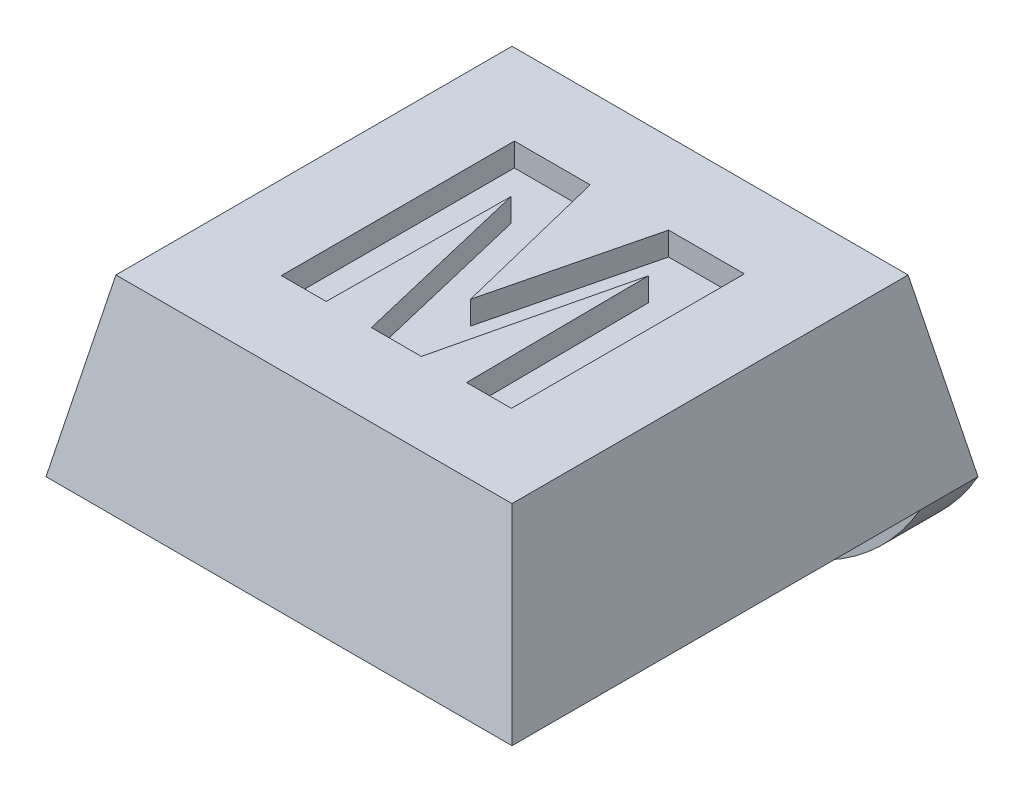
ISO-10303-21;
HEADER;
FILE_DESCRIPTION(('STEP AP214'),'2;1');
FILE_NAME('part.step','',(''),(''),'','','');
FILE_SCHEMA(('AUTOMOTIVE_DESIGN { 1 0 10303 214 1 1 1 1 }'));
ENDSEC;
DATA;
#1=APPLICATION_CONTEXT('core data for automotive mechanical design processes');
#2=APPLICATION_PROTOCOL_DEFINITION('international standard','automotive_design',2000,#1);
#3=PRODUCT_CONTEXT('',#1,'mechanical');
#4=PRODUCT('Part','Part','',(#3));
#5=PRODUCT_RELATED_PRODUCT_CATEGORY('part','',(#4));
#6=PRODUCT_DEFINITION_FORMATION('','',#4);
#7=PRODUCT_DEFINITION_CONTEXT('part definition',#1,'design');
#8=PRODUCT_DEFINITION('design','',#6,#7);
#9=PRODUCT_DEFINITION_SHAPE('','',#8);
#10=(LENGTH_UNIT() NAMED_UNIT(*) SI_UNIT(.MILLI.,.METRE.));
#11=(NAMED_UNIT(*) PLANE_ANGLE_UNIT() SI_UNIT($,.RADIAN.));
#12=(NAMED_UNIT(*) SI_UNIT($,.STERADIAN.) SOLID_ANGLE_UNIT());
#13=UNCERTAINTY_MEASURE_WITH_UNIT(LENGTH_MEASURE(1.E-05),#10,'distance_accuracy_value','');
#14=(GEOMETRIC_REPRESENTATION_CONTEXT(3) GLOBAL_UNCERTAINTY_ASSIGNED_CONTEXT((#13)) GLOBAL_UNIT_ASSIGNED_CONTEXT((#10,
#11,#12)) REPRESENTATION_CONTEXT('',''));
#15=CARTESIAN_POINT('',(0.,0.,0.));
#16=DIRECTION('',(0.,0.,1.));
#17=DIRECTION('',(1.,0.,0.));
#18=AXIS2_PLACEMENT_3D('',#15,#16,#17);
#19=CARTESIAN_POINT('',(0.,3.,0.));
#20=DIRECTION('',(0.,-1.,0.));
#21=DIRECTION('',(0.,0.,-1.));
#22=AXIS2_PLACEMENT_3D('',#19,#20,#21);
#23=PLANE('',#22);
#24=DIRECTION('',(-1.,0.,0.));
#25=VECTOR('',#24,1.);
#26=CARTESIAN_POINT('',(11.,3.,-0.6));
#27=LINE('',#26,#25);
#28=CARTESIAN_POINT('',(7.4,3.,-0.6));
#29=VERTEX_POINT('',#28);
#30=CARTESIAN_POINT('',(0.6,3.,-0.6));
#31=VERTEX_POINT('',#30);
#32=EDGE_CURVE('E235',#29,#31,#27,.T.);
#33=ORIENTED_EDGE('',*,*,#32,.F.);
#34=DIRECTION('',(0.,0.,1.));
#35=VECTOR('',#34,1.);
#36=CARTESIAN_POINT('',(7.4,3.,-8.));
#37=LINE('',#36,#35);
#38=CARTESIAN_POINT('',(7.4,3.,-7.4));
#39=VERTEX_POINT('',#38);
#40=EDGE_CURVE('E248',#39,#29,#37,.T.);
#41=ORIENTED_EDGE('',*,*,#40,.F.);
#42=DIRECTION('',(-1.,0.,0.));
#43=VECTOR('',#42,1.);
#44=CARTESIAN_POINT('',(11.,3.,-7.4));
#45=LINE('',#44,#43);
#46=CARTESIAN_POINT('',(0.599999999999999,3.,-7.4));
#47=VERTEX_POINT('',#46);
#48=EDGE_CURVE('E231',#39,#47,#45,.T.);
#49=ORIENTED_EDGE('',*,*,#48,.T.);
#50=DIRECTION('',(0.,0.,1.));
#51=VECTOR('',#50,1.);
#52=CARTESIAN_POINT('',(0.6,3.,-8.));
#53=LINE('',#52,#51);
#54=EDGE_CURVE('E251',#47,#31,#53,.T.);
#55=ORIENTED_EDGE('',*,*,#54,.T.);
#56=EDGE_LOOP('',(#33,#41,#49,#55));
#57=FACE_BOUND('',#56,.T.);
#58=DIRECTION('',(-1.,0.,0.));
#59=VECTOR('',#58,1.);
#60=CARTESIAN_POINT('',(2.79952143387891,3.,-2.0105672247147));
#61=LINE('',#60,#59);
#62=CARTESIAN_POINT('',(2.79952143387891,3.,-2.0105672247147));
#63=VERTEX_POINT('',#62);
#64=CARTESIAN_POINT('',(2.03029066464814,3.,-2.0105672247147));
#65=VERTEX_POINT('',#64);
#66=EDGE_CURVE('E58',#63,#65,#61,.T.);
#67=ORIENTED_EDGE('',*,*,#66,.T.);
#68=DIRECTION('',(0.,0.,-1.));
#69=VECTOR('',#68,1.);
#70=CARTESIAN_POINT('',(2.03029066464814,3.,-2.0105672247147));
#71=LINE('',#70,#69);
#72=CARTESIAN_POINT('',(2.03029066464814,3.,-6.0105672247147));
#73=VERTEX_POINT('',#72);
#74=EDGE_CURVE('E203',#65,#73,#71,.T.);
#75=ORIENTED_EDGE('',*,*,#74,.T.);
#76=DIRECTION('',(1.,0.,0.));
#77=VECTOR('',#76,1.);
#78=CARTESIAN_POINT('',(2.03029066464814,3.,-6.0105672247147));
#79=LINE('',#78,#77);
#80=CARTESIAN_POINT('',(3.33157271593019,3.,-6.0105672247147));
#81=VERTEX_POINT('',#80);
#82=EDGE_CURVE('E687',#73,#81,#79,.T.);
#83=ORIENTED_EDGE('',*,*,#82,.T.);
#84=DIRECTION('',(0.239515349551575,0.,0.970892577646563));
#85=VECTOR('',#84,1.);
#86=CARTESIAN_POINT('',(3.33157271593019,3.,-6.0105672247147));
#87=LINE('',#86,#85);
#88=CARTESIAN_POINT('',(4.00464963900711,3.,-3.28220184009932));
#89=VERTEX_POINT('',#88);
#90=EDGE_CURVE('E689',#81,#89,#87,.T.);
#91=ORIENTED_EDGE('',*,*,#90,.T.);
#92=DIRECTION('',(0.239515349551575,0.,-0.970892577646563));
#93=VECTOR('',#92,1.);
#94=CARTESIAN_POINT('',(4.00464963900711,3.,-3.28220184009932));
#95=LINE('',#94,#93);
#96=CARTESIAN_POINT('',(4.67772656208403,3.,-6.0105672247147));
#97=VERTEX_POINT('',#96);
#98=EDGE_CURVE('E694',#89,#97,#95,.T.);
#99=ORIENTED_EDGE('',*,*,#98,.T.);
#100=DIRECTION('',(1.,0.,0.));
#101=VECTOR('',#100,1.);
#102=CARTESIAN_POINT('',(4.67772656208403,3.,-6.0105672247147));
#103=LINE('',#102,#101);
#104=CARTESIAN_POINT('',(5.97900861336609,3.,-6.0105672247147));
#105=VERTEX_POINT('',#104);
#106=EDGE_CURVE('E704',#97,#105,#103,.T.);
#107=ORIENTED_EDGE('',*,*,#106,.T.);
#108=DIRECTION('',(0.,0.,1.));
#109=VECTOR('',#108,1.);
#110=CARTESIAN_POINT('',(5.97900861336609,3.,-6.0105672247147));
#111=LINE('',#110,#109);
#112=CARTESIAN_POINT('',(5.97900861336609,3.,-2.0105672247147));
#113=VERTEX_POINT('',#112);
#114=EDGE_CURVE('E708',#105,#113,#111,.T.);
#115=ORIENTED_EDGE('',*,*,#114,.T.);
#116=DIRECTION('',(-1.,0.,0.));
#117=VECTOR('',#116,1.);
#118=CARTESIAN_POINT('',(5.97900861336609,3.,-2.0105672247147));
#119=LINE('',#118,#117);
#120=CARTESIAN_POINT('',(5.20977784413532,3.,-2.0105672247147));
#121=VERTEX_POINT('',#120);
#122=EDGE_CURVE('E712',#113,#121,#119,.T.);
#123=ORIENTED_EDGE('',*,*,#122,.T.);
#124=DIRECTION('',(-0.00814222372760895,0.,-0.999966851546975));
#125=VECTOR('',#124,1.);
#126=CARTESIAN_POINT('',(5.20977784413532,3.,-2.0105672247147));
#127=LINE('',#126,#125);
#128=CARTESIAN_POINT('',(5.18413681849429,3.,-5.15960568625316));
#129=VERTEX_POINT('',#128);
#130=EDGE_CURVE('E716',#121,#129,#127,.T.);
#131=ORIENTED_EDGE('',*,*,#130,.T.);
#132=DIRECTION('',(-0.231921677320602,0.,0.972734463041584));
#133=VECTOR('',#132,1.);
#134=CARTESIAN_POINT('',(5.18413681849429,3.,-5.15960568625316));
#135=LINE('',#134,#133);
#136=CARTESIAN_POINT('',(4.43333553644301,3.,-2.0105672247147));
#137=VERTEX_POINT('',#136);
#138=EDGE_CURVE('E650',#129,#137,#135,.T.);
#139=ORIENTED_EDGE('',*,*,#138,.T.);
#140=DIRECTION('',(-1.,0.,0.));
#141=VECTOR('',#140,1.);
#142=CARTESIAN_POINT('',(4.43333553644301,3.,-2.0105672247147));
#143=LINE('',#142,#141);
#144=CARTESIAN_POINT('',(3.57596374157121,3.,-2.0105672247147));
#145=VERTEX_POINT('',#144);
#146=EDGE_CURVE('E645',#137,#145,#143,.T.);
#147=ORIENTED_EDGE('',*,*,#146,.T.);
#148=DIRECTION('',(-0.231921677320602,0.,-0.972734463041584));
#149=VECTOR('',#148,1.);
#150=CARTESIAN_POINT('',(3.57596374157121,3.,-2.0105672247147));
#151=LINE('',#150,#149);
#152=CARTESIAN_POINT('',(2.82516245951993,3.,-5.15960568625316));
#153=VERTEX_POINT('',#152);
#154=EDGE_CURVE('E639',#145,#153,#151,.T.);
#155=ORIENTED_EDGE('',*,*,#154,.T.);
#156=DIRECTION('',(-0.00814222372760895,0.,0.999966851546975));
#157=VECTOR('',#156,1.);
#158=CARTESIAN_POINT('',(2.82516245951993,3.,-5.15960568625316));
#159=LINE('',#158,#157);
#160=EDGE_CURVE('E199',#153,#63,#159,.T.);
#161=ORIENTED_EDGE('',*,*,#160,.T.);
#162=EDGE_LOOP('',(#67,#75,#83,#91,#99,#107,#115,#123,#131,#139,#147,#155,#161));
#163=FACE_BOUND('',#162,.T.);
#164=ADVANCED_FACE('F42',(#57,#163),#23,.F.);
#165=CARTESIAN_POINT('',(8.,0.,-8.));
#166=DIRECTION('',(-0.98058067569092,-0.196116135138184,0.));
#167=DIRECTION('',(0.196116135138184,-0.98058067569092,0.));
#168=AXIS2_PLACEMENT_3D('',#165,#166,#167);
#169=PLANE('',#168);
#170=DIRECTION('',(-0.192450089729875,0.962250448649376,-0.192450089729875));
#171=VECTOR('',#170,1.);
#172=CARTESIAN_POINT('',(7.7037037037037,1.48148148148148,-0.296296296296296));
#173=LINE('',#172,#171);
#174=CARTESIAN_POINT('',(8.,0.,0.));
#175=VERTEX_POINT('',#174);
#176=EDGE_CURVE('E245',#175,#29,#173,.T.);
#177=ORIENTED_EDGE('',*,*,#176,.F.);
#178=DIRECTION('',(0.,0.,-1.));
#179=VECTOR('',#178,1.);
#180=CARTESIAN_POINT('',(8.,0.,0.));
#181=LINE('',#180,#179);
#182=CARTESIAN_POINT('',(8.,0.,-7.));
#183=VERTEX_POINT('',#182);
#184=EDGE_CURVE('E264',#175,#183,#181,.T.);
#185=ORIENTED_EDGE('',*,*,#184,.T.);
#186=DIRECTION('',(0.,0.,1.));
#187=VECTOR('',#186,1.);
#188=CARTESIAN_POINT('',(8.,0.,-8.));
#189=LINE('',#188,#187);
#190=CARTESIAN_POINT('',(8.,0.,-8.));
#191=VERTEX_POINT('',#190);
#192=EDGE_CURVE('E205',#191,#183,#189,.T.);
#193=ORIENTED_EDGE('',*,*,#192,.F.);
#194=DIRECTION('',(0.192450089729875,-0.962250448649376,-0.192450089729875));
#195=VECTOR('',#194,1.);
#196=CARTESIAN_POINT('',(8.,0.,-8.));
#197=LINE('',#196,#195);
#198=EDGE_CURVE('E238',#39,#191,#197,.T.);
#199=ORIENTED_EDGE('',*,*,#198,.F.);
#200=ORIENTED_EDGE('',*,*,#40,.T.);
#201=EDGE_LOOP('',(#177,#185,#193,#199,#200));
#202=FACE_BOUND('',#201,.T.);
#203=ADVANCED_FACE('F332',(#202),#169,.F.);
#204=CARTESIAN_POINT('',(0.,0.,-8.));
#205=DIRECTION('',(0.98058067569092,-0.196116135138184,0.));
#206=DIRECTION('',(0.196116135138184,0.98058067569092,0.));
#207=AXIS2_PLACEMENT_3D('',#204,#205,#206);
#208=PLANE('',#207);
#209=DIRECTION('',(-0.192450089729875,-0.962250448649376,0.192450089729875));
#210=VECTOR('',#209,1.);
#211=CARTESIAN_POINT('',(0.296296296296296,1.48148148148148,-0.296296296296296));
#212=LINE('',#211,#210);
#213=CARTESIAN_POINT('',(0.,0.,0.));
#214=VERTEX_POINT('',#213);
#215=EDGE_CURVE('E292',#31,#214,#212,.T.);
#216=ORIENTED_EDGE('',*,*,#215,.F.);
#217=ORIENTED_EDGE('',*,*,#54,.F.);
#218=DIRECTION('',(0.192450089729875,0.962250448649376,0.192450089729875));
#219=VECTOR('',#218,1.);
#220=CARTESIAN_POINT('',(0.,0.,-8.));
#221=LINE('',#220,#219);
#222=CARTESIAN_POINT('',(0.,0.,-8.));
#223=VERTEX_POINT('',#222);
#224=EDGE_CURVE('E263',#223,#47,#221,.T.);
#225=ORIENTED_EDGE('',*,*,#224,.F.);
#226=DIRECTION('',(0.,0.,1.));
#227=VECTOR('',#226,1.);
#228=CARTESIAN_POINT('',(0.,0.,0.));
#229=LINE('',#228,#227);
#230=CARTESIAN_POINT('',(0.,0.,-7.));
#231=VERTEX_POINT('',#230);
#232=EDGE_CURVE('E268',#223,#231,#229,.T.);
#233=ORIENTED_EDGE('',*,*,#232,.T.);
#234=EDGE_CURVE('E255',#231,#214,#229,.T.);
#235=ORIENTED_EDGE('',*,*,#234,.T.);
#236=EDGE_LOOP('',(#216,#217,#225,#233,#235));
#237=FACE_BOUND('',#236,.T.);
#238=ADVANCED_FACE('F316',(#237),#208,.F.);
#239=CARTESIAN_POINT('',(0.,0.,0.));
#240=DIRECTION('',(0.,-1.,0.));
#241=DIRECTION('',(0.,0.,-1.));
#242=AXIS2_PLACEMENT_3D('',#239,#240,#241);
#243=PLANE('',#242);
#244=DIRECTION('',(-1.,0.,0.));
#245=VECTOR('',#244,1.);
#246=CARTESIAN_POINT('',(0.,0.,-7.));
#247=LINE('',#246,#245);
#248=EDGE_CURVE('E211',#183,#231,#247,.T.);
#249=ORIENTED_EDGE('',*,*,#248,.F.);
#250=ORIENTED_EDGE('',*,*,#184,.F.);
#251=DIRECTION('',(1.,0.,0.));
#252=VECTOR('',#251,1.);
#253=CARTESIAN_POINT('',(0.,0.,0.));
#254=LINE('',#253,#252);
#255=EDGE_CURVE('E265',#214,#175,#254,.T.);
#256=ORIENTED_EDGE('',*,*,#255,.F.);
#257=ORIENTED_EDGE('',*,*,#234,.F.);
#258=EDGE_LOOP('',(#249,#250,#256,#257));
#259=FACE_BOUND('',#258,.T.);
#260=CARTESIAN_POINT('',(4.,0.,-3.75));
#261=DIRECTION('',(0.,-1.,0.));
#262=DIRECTION('',(0.,0.,-1.));
#263=AXIS2_PLACEMENT_3D('',#260,#261,#262);
#264=CIRCLE('',#263,1.8);
#265=CARTESIAN_POINT('',(4.,0.,-5.55));
#266=VERTEX_POINT('',#265);
#267=EDGE_CURVE('E223',#266,#266,#264,.T.);
#268=ORIENTED_EDGE('',*,*,#267,.F.);
#269=EDGE_LOOP('',(#268));
#270=FACE_BOUND('',#269,.T.);
#271=ADVANCED_FACE('F327',(#259,#270),#243,.T.);
#272=CARTESIAN_POINT('',(11.,3.,-7.4));
#273=DIRECTION('',(0.,0.196116135138184,-0.98058067569092));
#274=DIRECTION('',(0.,0.98058067569092,0.196116135138184));
#275=AXIS2_PLACEMENT_3D('',#272,#273,#274);
#276=PLANE('',#275);
#277=ORIENTED_EDGE('',*,*,#198,.T.);
#278=DIRECTION('',(-1.,0.,0.));
#279=VECTOR('',#278,1.);
#280=CARTESIAN_POINT('',(0.,0.,-8.));
#281=LINE('',#280,#279);
#282=EDGE_CURVE('E259',#191,#223,#281,.T.);
#283=ORIENTED_EDGE('',*,*,#282,.T.);
#284=ORIENTED_EDGE('',*,*,#224,.T.);
#285=ORIENTED_EDGE('',*,*,#48,.F.);
#286=EDGE_LOOP('',(#277,#283,#284,#285));
#287=FACE_BOUND('',#286,.T.);
#288=ADVANCED_FACE('F311',(#287),#276,.T.);
#289=CARTESIAN_POINT('',(11.,0.,0.));
#290=DIRECTION('',(0.,0.196116135138184,0.98058067569092));
#291=DIRECTION('',(0.,-0.98058067569092,0.196116135138184));
#292=AXIS2_PLACEMENT_3D('',#289,#290,#291);
#293=PLANE('',#292);
#294=ORIENTED_EDGE('',*,*,#176,.T.);
#295=ORIENTED_EDGE('',*,*,#32,.T.);
#296=ORIENTED_EDGE('',*,*,#215,.T.);
#297=ORIENTED_EDGE('',*,*,#255,.T.);
#298=EDGE_LOOP('',(#294,#295,#296,#297));
#299=FACE_BOUND('',#298,.T.);
#300=ADVANCED_FACE('F358',(#299),#293,.T.);
#301=CARTESIAN_POINT('',(4.,0.8,-3.75));
#302=DIRECTION('',(0.,-1.,0.));
#303=DIRECTION('',(0.,0.,-1.));
#304=AXIS2_PLACEMENT_3D('',#301,#302,#303);
#305=CYLINDRICAL_SURFACE('',#304,1.8);
#306=CARTESIAN_POINT('',(4.,0.8,-3.75));
#307=DIRECTION('',(0.,-1.,0.));
#308=DIRECTION('',(0.,0.,-1.));
#309=AXIS2_PLACEMENT_3D('',#306,#307,#308);
#310=CIRCLE('',#309,1.8);
#311=CARTESIAN_POINT('',(4.,0.8,-5.55));
#312=VERTEX_POINT('',#311);
#313=EDGE_CURVE('E227',#312,#312,#310,.T.);
#314=ORIENTED_EDGE('',*,*,#313,.F.);
#315=EDGE_LOOP('',(#314));
#316=FACE_BOUND('',#315,.T.);
#317=ORIENTED_EDGE('',*,*,#267,.T.);
#318=EDGE_LOOP('',(#317));
#319=FACE_BOUND('',#318,.T.);
#320=ADVANCED_FACE('F365',(#316,#319),#305,.F.);
#321=CARTESIAN_POINT('',(4.,0.8,-3.75));
#322=DIRECTION('',(0.,-1.,0.));
#323=DIRECTION('',(0.,0.,-1.));
#324=AXIS2_PLACEMENT_3D('',#321,#322,#323);
#325=PLANE('',#324);
#326=ORIENTED_EDGE('',*,*,#313,.T.);
#327=EDGE_LOOP('',(#326));
#328=FACE_BOUND('',#327,.T.);
#329=ADVANCED_FACE('F369',(#328),#325,.T.);
#330=CARTESIAN_POINT('',(0.,-2.,-8.));
#331=DIRECTION('',(0.,0.,1.));
#332=DIRECTION('',(1.,0.,0.));
#333=AXIS2_PLACEMENT_3D('',#330,#331,#332);
#334=PLANE('',#333);
#335=ORIENTED_EDGE('',*,*,#282,.F.);
#336=CARTESIAN_POINT('',(4.53589838486225,2.,-8.));
#337=DIRECTION('',(0.,0.,1.));
#338=DIRECTION('',(1.,0.,0.));
#339=AXIS2_PLACEMENT_3D('',#336,#337,#338);
#340=CIRCLE('',#339,4.);
#341=CARTESIAN_POINT('',(4.53589838486225,-2.,-8.));
#342=VERTEX_POINT('',#341);
#343=EDGE_CURVE('E11',#191,#342,#340,.F.);
#344=ORIENTED_EDGE('',*,*,#343,.T.);
#345=DIRECTION('',(1.,0.,0.));
#346=VECTOR('',#345,1.);
#347=CARTESIAN_POINT('',(0.,-2.,-8.));
#348=LINE('',#347,#346);
#349=CARTESIAN_POINT('',(3.46410161513775,-2.,-8.));
#350=VERTEX_POINT('',#349);
#351=EDGE_CURVE('E217',#350,#342,#348,.T.);
#352=ORIENTED_EDGE('',*,*,#351,.F.);
#353=CARTESIAN_POINT('',(3.46410161513775,2.,-8.));
#354=DIRECTION('',(0.,0.,1.));
#355=DIRECTION('',(1.,0.,0.));
#356=AXIS2_PLACEMENT_3D('',#353,#354,#355);
#357=CIRCLE('',#356,4.);
#358=EDGE_CURVE('E51',#350,#223,#357,.F.);
#359=ORIENTED_EDGE('',*,*,#358,.T.);
#360=EDGE_LOOP('',(#335,#344,#352,#359));
#361=FACE_BOUND('',#360,.T.);
#362=ADVANCED_FACE('F304',(#361),#334,.F.);
#363=CARTESIAN_POINT('',(0.,-2.,-7.));
#364=DIRECTION('',(0.,0.,-1.));
#365=DIRECTION('',(-1.,0.,0.));
#366=AXIS2_PLACEMENT_3D('',#363,#364,#365);
#367=PLANE('',#366);
#368=DIRECTION('',(-1.,0.,0.));
#369=VECTOR('',#368,1.);
#370=CARTESIAN_POINT('',(0.,-2.,-7.));
#371=LINE('',#370,#369);
#372=CARTESIAN_POINT('',(4.53589838486225,-2.,-7.));
#373=VERTEX_POINT('',#372);
#374=CARTESIAN_POINT('',(3.46410161513775,-2.,-7.));
#375=VERTEX_POINT('',#374);
#376=EDGE_CURVE('E221',#373,#375,#371,.T.);
#377=ORIENTED_EDGE('',*,*,#376,.F.);
#378=CARTESIAN_POINT('',(4.53589838486225,2.,-7.));
#379=DIRECTION('',(0.,0.,-1.));
#380=DIRECTION('',(-1.,0.,0.));
#381=AXIS2_PLACEMENT_3D('',#378,#379,#380);
#382=CIRCLE('',#381,4.);
#383=EDGE_CURVE('E298',#373,#183,#382,.F.);
#384=ORIENTED_EDGE('',*,*,#383,.T.);
#385=ORIENTED_EDGE('',*,*,#248,.T.);
#386=CARTESIAN_POINT('',(3.46410161513775,2.,-7.));
#387=DIRECTION('',(0.,0.,-1.));
#388=DIRECTION('',(-1.,0.,0.));
#389=AXIS2_PLACEMENT_3D('',#386,#387,#388);
#390=CIRCLE('',#389,4.);
#391=EDGE_CURVE('E66',#231,#375,#390,.F.);
#392=ORIENTED_EDGE('',*,*,#391,.T.);
#393=EDGE_LOOP('',(#377,#384,#385,#392));
#394=FACE_BOUND('',#393,.T.);
#395=ADVANCED_FACE('F322',(#394),#367,.F.);
#396=CARTESIAN_POINT('',(0.,-2.,0.));
#397=DIRECTION('',(0.,1.,0.));
#398=DIRECTION('',(0.,0.,1.));
#399=AXIS2_PLACEMENT_3D('',#396,#397,#398);
#400=PLANE('',#399);
#401=ORIENTED_EDGE('',*,*,#351,.T.);
#402=DIRECTION('',(0.,0.,1.));
#403=VECTOR('',#402,1.);
#404=CARTESIAN_POINT('',(4.53589838486225,-2.,0.));
#405=LINE('',#404,#403);
#406=EDGE_CURVE('E291',#342,#373,#405,.T.);
#407=ORIENTED_EDGE('',*,*,#406,.T.);
#408=ORIENTED_EDGE('',*,*,#376,.T.);
#409=DIRECTION('',(0.,0.,-1.));
#410=VECTOR('',#409,1.);
#411=CARTESIAN_POINT('',(3.46410161513775,-2.,0.));
#412=LINE('',#411,#410);
#413=EDGE_CURVE('E287',#375,#350,#412,.T.);
#414=ORIENTED_EDGE('',*,*,#413,.T.);
#415=EDGE_LOOP('',(#401,#407,#408,#414));
#416=FACE_BOUND('',#415,.T.);
#417=ADVANCED_FACE('F320',(#416),#400,.F.);
#418=CARTESIAN_POINT('',(4.53589838486225,2.,-8.));
#419=DIRECTION('',(0.,0.,1.));
#420=DIRECTION('',(1.,0.,0.));
#421=AXIS2_PLACEMENT_3D('',#418,#419,#420);
#422=CYLINDRICAL_SURFACE('',#421,4.);
#423=ORIENTED_EDGE('',*,*,#343,.F.);
#424=ORIENTED_EDGE('',*,*,#192,.T.);
#425=ORIENTED_EDGE('',*,*,#383,.F.);
#426=ORIENTED_EDGE('',*,*,#406,.F.);
#427=EDGE_LOOP('',(#423,#424,#425,#426));
#428=FACE_BOUND('',#427,.T.);
#429=ADVANCED_FACE('F333',(#428),#422,.T.);
#430=CARTESIAN_POINT('',(3.46410161513775,2.,-8.));
#431=DIRECTION('',(0.,0.,-1.));
#432=DIRECTION('',(-1.,0.,0.));
#433=AXIS2_PLACEMENT_3D('',#430,#431,#432);
#434=CYLINDRICAL_SURFACE('',#433,4.);
#435=ORIENTED_EDGE('',*,*,#391,.F.);
#436=ORIENTED_EDGE('',*,*,#232,.F.);
#437=ORIENTED_EDGE('',*,*,#358,.F.);
#438=ORIENTED_EDGE('',*,*,#413,.F.);
#439=EDGE_LOOP('',(#435,#436,#437,#438));
#440=FACE_BOUND('',#439,.T.);
#441=ADVANCED_FACE('F44',(#440),#434,.T.);
#442=CARTESIAN_POINT('',(2.79952143387891,2.6,-2.0105672247147));
#443=DIRECTION('',(0.,0.,-1.));
#444=DIRECTION('',(-1.,0.,0.));
#445=AXIS2_PLACEMENT_3D('',#442,#443,#444);
#446=PLANE('',#445);
#447=ORIENTED_EDGE('',*,*,#66,.F.);
#448=DIRECTION('',(0.,1.,0.));
#449=VECTOR('',#448,1.);
#450=CARTESIAN_POINT('',(2.79952143387891,2.6,-2.0105672247147));
#451=LINE('',#450,#449);
#452=CARTESIAN_POINT('',(2.79952143387891,2.6,-2.0105672247147));
#453=VERTEX_POINT('',#452);
#454=EDGE_CURVE('E197',#453,#63,#451,.T.);
#455=ORIENTED_EDGE('',*,*,#454,.F.);
#456=DIRECTION('',(-1.,0.,0.));
#457=VECTOR('',#456,1.);
#458=CARTESIAN_POINT('',(2.79952143387891,2.6,-2.0105672247147));
#459=LINE('',#458,#457);
#460=CARTESIAN_POINT('',(2.03029066464814,2.6,-2.0105672247147));
#461=VERTEX_POINT('',#460);
#462=EDGE_CURVE('E187',#453,#461,#459,.T.);
#463=ORIENTED_EDGE('',*,*,#462,.T.);
#464=DIRECTION('',(0.,1.,0.));
#465=VECTOR('',#464,1.);
#466=CARTESIAN_POINT('',(2.03029066464814,2.6,-2.0105672247147));
#467=LINE('',#466,#465);
#468=EDGE_CURVE('E196',#461,#65,#467,.T.);
#469=ORIENTED_EDGE('',*,*,#468,.T.);
#470=EDGE_LOOP('',(#447,#455,#463,#469));
#471=FACE_BOUND('',#470,.T.);
#472=ADVANCED_FACE('F195',(#471),#446,.T.);
#473=CARTESIAN_POINT('',(2.03029066464814,2.6,-2.0105672247147));
#474=DIRECTION('',(1.,0.,0.));
#475=DIRECTION('',(0.,0.,-1.));
#476=AXIS2_PLACEMENT_3D('',#473,#474,#475);
#477=PLANE('',#476);
#478=ORIENTED_EDGE('',*,*,#74,.F.);
#479=ORIENTED_EDGE('',*,*,#468,.F.);
#480=DIRECTION('',(0.,0.,-1.));
#481=VECTOR('',#480,1.);
#482=CARTESIAN_POINT('',(2.03029066464814,2.6,-2.0105672247147));
#483=LINE('',#482,#481);
#484=CARTESIAN_POINT('',(2.03029066464814,2.6,-6.0105672247147));
#485=VERTEX_POINT('',#484);
#486=EDGE_CURVE('E183',#461,#485,#483,.T.);
#487=ORIENTED_EDGE('',*,*,#486,.T.);
#488=DIRECTION('',(0.,1.,0.));
#489=VECTOR('',#488,1.);
#490=CARTESIAN_POINT('',(2.03029066464814,2.6,-6.0105672247147));
#491=LINE('',#490,#489);
#492=EDGE_CURVE('E206',#485,#73,#491,.T.);
#493=ORIENTED_EDGE('',*,*,#492,.T.);
#494=EDGE_LOOP('',(#478,#479,#487,#493));
#495=FACE_BOUND('',#494,.T.);
#496=ADVANCED_FACE('F201',(#495),#477,.T.);
#497=CARTESIAN_POINT('',(2.03029066464814,2.6,-6.0105672247147));
#498=DIRECTION('',(0.,0.,1.));
#499=DIRECTION('',(1.,0.,0.));
#500=AXIS2_PLACEMENT_3D('',#497,#498,#499);
#501=PLANE('',#500);
#502=ORIENTED_EDGE('',*,*,#82,.F.);
#503=ORIENTED_EDGE('',*,*,#492,.F.);
#504=DIRECTION('',(1.,0.,0.));
#505=VECTOR('',#504,1.);
#506=CARTESIAN_POINT('',(2.03029066464814,2.6,-6.0105672247147));
#507=LINE('',#506,#505);
#508=CARTESIAN_POINT('',(3.33157271593019,2.6,-6.0105672247147));
#509=VERTEX_POINT('',#508);
#510=EDGE_CURVE('E189',#485,#509,#507,.T.);
#511=ORIENTED_EDGE('',*,*,#510,.T.);
#512=DIRECTION('',(0.,1.,0.));
#513=VECTOR('',#512,1.);
#514=CARTESIAN_POINT('',(3.33157271593019,2.6,-6.0105672247147));
#515=LINE('',#514,#513);
#516=EDGE_CURVE('E213',#509,#81,#515,.T.);
#517=ORIENTED_EDGE('',*,*,#516,.T.);
#518=EDGE_LOOP('',(#502,#503,#511,#517));
#519=FACE_BOUND('',#518,.T.);
#520=ADVANCED_FACE('F382',(#519),#501,.T.);
#521=CARTESIAN_POINT('',(3.33157271593019,2.6,-6.0105672247147));
#522=DIRECTION('',(-0.970892577646563,0.,0.239515349551575));
#523=DIRECTION('',(0.239515349551575,0.,0.970892577646563));
#524=AXIS2_PLACEMENT_3D('',#521,#522,#523);
#525=PLANE('',#524);
#526=ORIENTED_EDGE('',*,*,#90,.F.);
#527=ORIENTED_EDGE('',*,*,#516,.F.);
#528=DIRECTION('',(0.239515349551575,0.,0.970892577646563));
#529=VECTOR('',#528,1.);
#530=CARTESIAN_POINT('',(3.33157271593019,2.6,-6.0105672247147));
#531=LINE('',#530,#529);
#532=CARTESIAN_POINT('',(4.00464963900711,2.6,-3.28220184009932));
#533=VERTEX_POINT('',#532);
#534=EDGE_CURVE('E755',#509,#533,#531,.T.);
#535=ORIENTED_EDGE('',*,*,#534,.T.);
#536=DIRECTION('',(0.,1.,0.));
#537=VECTOR('',#536,1.);
#538=CARTESIAN_POINT('',(4.00464963900711,2.6,-3.28220184009932));
#539=LINE('',#538,#537);
#540=EDGE_CURVE('E680',#533,#89,#539,.T.);
#541=ORIENTED_EDGE('',*,*,#540,.T.);
#542=EDGE_LOOP('',(#526,#527,#535,#541));
#543=FACE_BOUND('',#542,.T.);
#544=ADVANCED_FACE('F385',(#543),#525,.T.);
#545=CARTESIAN_POINT('',(4.00464963900711,2.6,-3.28220184009932));
#546=DIRECTION('',(0.970892577646563,0.,0.239515349551575));
#547=DIRECTION('',(0.239515349551575,0.,-0.970892577646563));
#548=AXIS2_PLACEMENT_3D('',#545,#546,#547);
#549=PLANE('',#548);
#550=ORIENTED_EDGE('',*,*,#98,.F.);
#551=ORIENTED_EDGE('',*,*,#540,.F.);
#552=DIRECTION('',(0.239515349551575,0.,-0.970892577646563));
#553=VECTOR('',#552,1.);
#554=CARTESIAN_POINT('',(4.00464963900711,2.6,-3.28220184009932));
#555=LINE('',#554,#553);
#556=CARTESIAN_POINT('',(4.67772656208403,2.6,-6.0105672247147));
#557=VERTEX_POINT('',#556);
#558=EDGE_CURVE('E752',#533,#557,#555,.T.);
#559=ORIENTED_EDGE('',*,*,#558,.T.);
#560=DIRECTION('',(0.,1.,0.));
#561=VECTOR('',#560,1.);
#562=CARTESIAN_POINT('',(4.67772656208403,2.6,-6.0105672247147));
#563=LINE('',#562,#561);
#564=EDGE_CURVE('E677',#557,#97,#563,.T.);
#565=ORIENTED_EDGE('',*,*,#564,.T.);
#566=EDGE_LOOP('',(#550,#551,#559,#565));
#567=FACE_BOUND('',#566,.T.);
#568=ADVANCED_FACE('F389',(#567),#549,.T.);
#569=CARTESIAN_POINT('',(4.67772656208403,2.6,-6.0105672247147));
#570=DIRECTION('',(0.,0.,1.));
#571=DIRECTION('',(1.,0.,0.));
#572=AXIS2_PLACEMENT_3D('',#569,#570,#571);
#573=PLANE('',#572);
#574=ORIENTED_EDGE('',*,*,#106,.F.);
#575=ORIENTED_EDGE('',*,*,#564,.F.);
#576=DIRECTION('',(1.,0.,0.));
#577=VECTOR('',#576,1.);
#578=CARTESIAN_POINT('',(4.67772656208403,2.6,-6.0105672247147));
#579=LINE('',#578,#577);
#580=CARTESIAN_POINT('',(5.97900861336609,2.6,-6.0105672247147));
#581=VERTEX_POINT('',#580);
#582=EDGE_CURVE('E749',#557,#581,#579,.T.);
#583=ORIENTED_EDGE('',*,*,#582,.T.);
#584=DIRECTION('',(0.,1.,0.));
#585=VECTOR('',#584,1.);
#586=CARTESIAN_POINT('',(5.97900861336609,2.6,-6.0105672247147));
#587=LINE('',#586,#585);
#588=EDGE_CURVE('E674',#581,#105,#587,.T.);
#589=ORIENTED_EDGE('',*,*,#588,.T.);
#590=EDGE_LOOP('',(#574,#575,#583,#589));
#591=FACE_BOUND('',#590,.T.);
#592=ADVANCED_FACE('F393',(#591),#573,.T.);
#593=CARTESIAN_POINT('',(5.97900861336609,2.6,-6.0105672247147));
#594=DIRECTION('',(-1.,0.,0.));
#595=DIRECTION('',(0.,0.,1.));
#596=AXIS2_PLACEMENT_3D('',#593,#594,#595);
#597=PLANE('',#596);
#598=ORIENTED_EDGE('',*,*,#114,.F.);
#599=ORIENTED_EDGE('',*,*,#588,.F.);
#600=DIRECTION('',(0.,0.,1.));
#601=VECTOR('',#600,1.);
#602=CARTESIAN_POINT('',(5.97900861336609,2.6,-6.0105672247147));
#603=LINE('',#602,#601);
#604=CARTESIAN_POINT('',(5.97900861336609,2.6,-2.0105672247147));
#605=VERTEX_POINT('',#604);
#606=EDGE_CURVE('E746',#581,#605,#603,.T.);
#607=ORIENTED_EDGE('',*,*,#606,.T.);
#608=DIRECTION('',(0.,1.,0.));
#609=VECTOR('',#608,1.);
#610=CARTESIAN_POINT('',(5.97900861336609,2.6,-2.0105672247147));
#611=LINE('',#610,#609);
#612=EDGE_CURVE('E671',#605,#113,#611,.T.);
#613=ORIENTED_EDGE('',*,*,#612,.T.);
#614=EDGE_LOOP('',(#598,#599,#607,#613));
#615=FACE_BOUND('',#614,.T.);
#616=ADVANCED_FACE('F397',(#615),#597,.T.);
#617=CARTESIAN_POINT('',(5.97900861336609,2.6,-2.0105672247147));
#618=DIRECTION('',(0.,0.,-1.));
#619=DIRECTION('',(-1.,0.,0.));
#620=AXIS2_PLACEMENT_3D('',#617,#618,#619);
#621=PLANE('',#620);
#622=ORIENTED_EDGE('',*,*,#122,.F.);
#623=ORIENTED_EDGE('',*,*,#612,.F.);
#624=DIRECTION('',(-1.,0.,0.));
#625=VECTOR('',#624,1.);
#626=CARTESIAN_POINT('',(5.97900861336609,2.6,-2.0105672247147));
#627=LINE('',#626,#625);
#628=CARTESIAN_POINT('',(5.20977784413532,2.6,-2.0105672247147));
#629=VERTEX_POINT('',#628);
#630=EDGE_CURVE('E743',#605,#629,#627,.T.);
#631=ORIENTED_EDGE('',*,*,#630,.T.);
#632=DIRECTION('',(0.,1.,0.));
#633=VECTOR('',#632,1.);
#634=CARTESIAN_POINT('',(5.20977784413532,2.6,-2.0105672247147));
#635=LINE('',#634,#633);
#636=EDGE_CURVE('E668',#629,#121,#635,.T.);
#637=ORIENTED_EDGE('',*,*,#636,.T.);
#638=EDGE_LOOP('',(#622,#623,#631,#637));
#639=FACE_BOUND('',#638,.T.);
#640=ADVANCED_FACE('F401',(#639),#621,.T.);
#641=CARTESIAN_POINT('',(5.20977784413532,2.6,-2.0105672247147));
#642=DIRECTION('',(0.999966851546975,0.,-0.00814222372760895));
#643=DIRECTION('',(-0.00814222372760895,0.,-0.999966851546975));
#644=AXIS2_PLACEMENT_3D('',#641,#642,#643);
#645=PLANE('',#644);
#646=ORIENTED_EDGE('',*,*,#130,.F.);
#647=ORIENTED_EDGE('',*,*,#636,.F.);
#648=DIRECTION('',(-0.00814222372760895,0.,-0.999966851546975));
#649=VECTOR('',#648,1.);
#650=CARTESIAN_POINT('',(5.20977784413532,2.6,-2.0105672247147));
#651=LINE('',#650,#649);
#652=CARTESIAN_POINT('',(5.18413681849429,2.6,-5.15960568625316));
#653=VERTEX_POINT('',#652);
#654=EDGE_CURVE('E740',#629,#653,#651,.T.);
#655=ORIENTED_EDGE('',*,*,#654,.T.);
#656=DIRECTION('',(0.,1.,0.));
#657=VECTOR('',#656,1.);
#658=CARTESIAN_POINT('',(5.18413681849429,2.6,-5.15960568625316));
#659=LINE('',#658,#657);
#660=EDGE_CURVE('E665',#653,#129,#659,.T.);
#661=ORIENTED_EDGE('',*,*,#660,.T.);
#662=EDGE_LOOP('',(#646,#647,#655,#661));
#663=FACE_BOUND('',#662,.T.);
#664=ADVANCED_FACE('F405',(#663),#645,.T.);
#665=CARTESIAN_POINT('',(5.18413681849429,2.6,-5.15960568625316));
#666=DIRECTION('',(-0.972734463041584,0.,-0.231921677320602));
#667=DIRECTION('',(-0.231921677320602,0.,0.972734463041584));
#668=AXIS2_PLACEMENT_3D('',#665,#666,#667);
#669=PLANE('',#668);
#670=ORIENTED_EDGE('',*,*,#138,.F.);
#671=ORIENTED_EDGE('',*,*,#660,.F.);
#672=DIRECTION('',(-0.231921677320602,0.,0.972734463041584));
#673=VECTOR('',#672,1.);
#674=CARTESIAN_POINT('',(5.18413681849429,2.6,-5.15960568625316));
#675=LINE('',#674,#673);
#676=CARTESIAN_POINT('',(4.43333553644301,2.6,-2.0105672247147));
#677=VERTEX_POINT('',#676);
#678=EDGE_CURVE('E725',#653,#677,#675,.T.);
#679=ORIENTED_EDGE('',*,*,#678,.T.);
#680=DIRECTION('',(0.,1.,0.));
#681=VECTOR('',#680,1.);
#682=CARTESIAN_POINT('',(4.43333553644301,2.6,-2.0105672247147));
#683=LINE('',#682,#681);
#684=EDGE_CURVE('E662',#677,#137,#683,.T.);
#685=ORIENTED_EDGE('',*,*,#684,.T.);
#686=EDGE_LOOP('',(#670,#671,#679,#685));
#687=FACE_BOUND('',#686,.T.);
#688=ADVANCED_FACE('F409',(#687),#669,.T.);
#689=CARTESIAN_POINT('',(4.43333553644301,2.6,-2.0105672247147));
#690=DIRECTION('',(0.,0.,-1.));
#691=DIRECTION('',(-1.,0.,0.));
#692=AXIS2_PLACEMENT_3D('',#689,#690,#691);
#693=PLANE('',#692);
#694=ORIENTED_EDGE('',*,*,#146,.F.);
#695=ORIENTED_EDGE('',*,*,#684,.F.);
#696=DIRECTION('',(-1.,0.,0.));
#697=VECTOR('',#696,1.);
#698=CARTESIAN_POINT('',(4.43333553644301,2.6,-2.0105672247147));
#699=LINE('',#698,#697);
#700=CARTESIAN_POINT('',(3.57596374157121,2.6,-2.0105672247147));
#701=VERTEX_POINT('',#700);
#702=EDGE_CURVE('E727',#677,#701,#699,.T.);
#703=ORIENTED_EDGE('',*,*,#702,.T.);
#704=DIRECTION('',(0.,1.,0.));
#705=VECTOR('',#704,1.);
#706=CARTESIAN_POINT('',(3.57596374157121,2.6,-2.0105672247147));
#707=LINE('',#706,#705);
#708=EDGE_CURVE('E659',#701,#145,#707,.T.);
#709=ORIENTED_EDGE('',*,*,#708,.T.);
#710=EDGE_LOOP('',(#694,#695,#703,#709));
#711=FACE_BOUND('',#710,.T.);
#712=ADVANCED_FACE('F413',(#711),#693,.T.);
#713=CARTESIAN_POINT('',(3.57596374157121,2.6,-2.0105672247147));
#714=DIRECTION('',(0.972734463041584,0.,-0.231921677320602));
#715=DIRECTION('',(-0.231921677320602,0.,-0.972734463041584));
#716=AXIS2_PLACEMENT_3D('',#713,#714,#715);
#717=PLANE('',#716);
#718=ORIENTED_EDGE('',*,*,#154,.F.);
#719=ORIENTED_EDGE('',*,*,#708,.F.);
#720=DIRECTION('',(-0.231921677320602,0.,-0.972734463041584));
#721=VECTOR('',#720,1.);
#722=CARTESIAN_POINT('',(3.57596374157121,2.6,-2.0105672247147));
#723=LINE('',#722,#721);
#724=CARTESIAN_POINT('',(2.82516245951993,2.6,-5.15960568625316));
#725=VERTEX_POINT('',#724);
#726=EDGE_CURVE('E729',#701,#725,#723,.T.);
#727=ORIENTED_EDGE('',*,*,#726,.T.);
#728=DIRECTION('',(0.,1.,0.));
#729=VECTOR('',#728,1.);
#730=CARTESIAN_POINT('',(2.82516245951993,2.6,-5.15960568625316));
#731=LINE('',#730,#729);
#732=EDGE_CURVE('E637',#725,#153,#731,.T.);
#733=ORIENTED_EDGE('',*,*,#732,.T.);
#734=EDGE_LOOP('',(#718,#719,#727,#733));
#735=FACE_BOUND('',#734,.T.);
#736=ADVANCED_FACE('F417',(#735),#717,.T.);
#737=CARTESIAN_POINT('',(2.82516245951993,2.6,-5.15960568625316));
#738=DIRECTION('',(-0.999966851546975,0.,-0.00814222372760895));
#739=DIRECTION('',(-0.00814222372760895,0.,0.999966851546975));
#740=AXIS2_PLACEMENT_3D('',#737,#738,#739);
#741=PLANE('',#740);
#742=ORIENTED_EDGE('',*,*,#160,.F.);
#743=ORIENTED_EDGE('',*,*,#732,.F.);
#744=DIRECTION('',(-0.00814222372760895,0.,0.999966851546975));
#745=VECTOR('',#744,1.);
#746=CARTESIAN_POINT('',(2.82516245951993,2.6,-5.15960568625316));
#747=LINE('',#746,#745);
#748=EDGE_CURVE('E656',#725,#453,#747,.T.);
#749=ORIENTED_EDGE('',*,*,#748,.T.);
#750=ORIENTED_EDGE('',*,*,#454,.T.);
#751=EDGE_LOOP('',(#742,#743,#749,#750));
#752=FACE_BOUND('',#751,.T.);
#753=ADVANCED_FACE('F421',(#752),#741,.T.);
#754=CARTESIAN_POINT('',(0.,2.6,0.));
#755=DIRECTION('',(0.,-1.,0.));
#756=DIRECTION('',(0.,0.,-1.));
#757=AXIS2_PLACEMENT_3D('',#754,#755,#756);
#758=PLANE('',#757);
#759=ORIENTED_EDGE('',*,*,#462,.F.);
#760=ORIENTED_EDGE('',*,*,#748,.F.);
#761=ORIENTED_EDGE('',*,*,#726,.F.);
#762=ORIENTED_EDGE('',*,*,#702,.F.);
#763=ORIENTED_EDGE('',*,*,#678,.F.);
#764=ORIENTED_EDGE('',*,*,#654,.F.);
#765=ORIENTED_EDGE('',*,*,#630,.F.);
#766=ORIENTED_EDGE('',*,*,#606,.F.);
#767=ORIENTED_EDGE('',*,*,#582,.F.);
#768=ORIENTED_EDGE('',*,*,#558,.F.);
#769=ORIENTED_EDGE('',*,*,#534,.F.);
#770=ORIENTED_EDGE('',*,*,#510,.F.);
#771=ORIENTED_EDGE('',*,*,#486,.F.);
#772=EDGE_LOOP('',(#759,#760,#761,#762,#763,#764,#765,#766,#767,#768,#769,#770,#771));
#773=FACE_BOUND('',#772,.T.);
#774=ADVANCED_FACE('F185',(#773),#758,.F.);
#775=CLOSED_SHELL('',(#164,#203,#238,#271,#288,#300,#320,#329,#362,#395,#417,#429,#441,#472,
#496,#520,#544,#568,#592,#616,#640,#664,#688,#712,#736,#753,#774));
#776=MANIFOLD_SOLID_BREP('B2',#775);
#777=ADVANCED_BREP_SHAPE_REPRESENTATION('',(#18,#776),#14);
#778=SHAPE_DEFINITION_REPRESENTATION(#9,#777);
ENDSEC;
END-ISO-10303-21;
